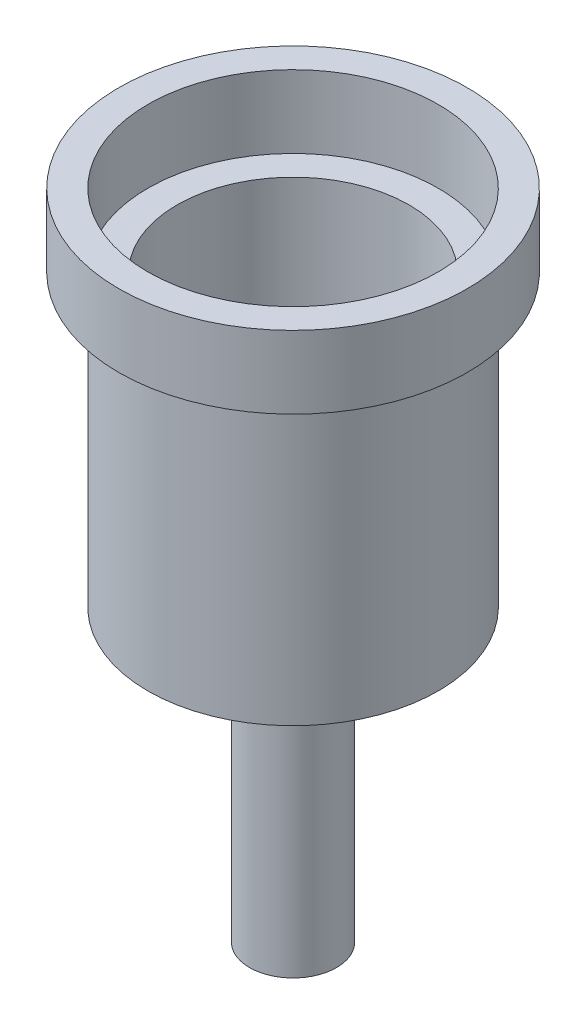
ISO-10303-21;
HEADER;
FILE_DESCRIPTION(('STEP AP214'),'2;1');
FILE_NAME('part.step','',(''),(''),'','','');
FILE_SCHEMA(('AUTOMOTIVE_DESIGN { 1 0 10303 214 1 1 1 1 }'));
ENDSEC;
DATA;
#1=APPLICATION_CONTEXT('core data for automotive mechanical design processes');
#2=APPLICATION_PROTOCOL_DEFINITION('international standard','automotive_design',2000,#1);
#3=PRODUCT_CONTEXT('',#1,'mechanical');
#4=PRODUCT('Part','Part','',(#3));
#5=PRODUCT_RELATED_PRODUCT_CATEGORY('part','',(#4));
#6=PRODUCT_DEFINITION_FORMATION('','',#4);
#7=PRODUCT_DEFINITION_CONTEXT('part definition',#1,'design');
#8=PRODUCT_DEFINITION('design','',#6,#7);
#9=PRODUCT_DEFINITION_SHAPE('','',#8);
#10=(LENGTH_UNIT() NAMED_UNIT(*) SI_UNIT(.MILLI.,.METRE.));
#11=(NAMED_UNIT(*) PLANE_ANGLE_UNIT() SI_UNIT($,.RADIAN.));
#12=(NAMED_UNIT(*) SI_UNIT($,.STERADIAN.) SOLID_ANGLE_UNIT());
#13=UNCERTAINTY_MEASURE_WITH_UNIT(LENGTH_MEASURE(1.E-05),#10,'distance_accuracy_value','');
#14=(GEOMETRIC_REPRESENTATION_CONTEXT(3) GLOBAL_UNCERTAINTY_ASSIGNED_CONTEXT((#13)) GLOBAL_UNIT_ASSIGNED_CONTEXT((#10,
#11,#12)) REPRESENTATION_CONTEXT('',''));
#15=CARTESIAN_POINT('',(0.,0.,0.));
#16=DIRECTION('',(0.,0.,1.));
#17=DIRECTION('',(1.,0.,0.));
#18=AXIS2_PLACEMENT_3D('',#15,#16,#17);
#19=CARTESIAN_POINT('',(0.,28.575,0.));
#20=DIRECTION('',(0.,1.,0.));
#21=DIRECTION('',(0.,0.,1.));
#22=AXIS2_PLACEMENT_3D('',#19,#20,#21);
#23=PLANE('',#22);
#24=CARTESIAN_POINT('',(0.,28.575,0.));
#25=DIRECTION('',(0.,1.,0.));
#26=DIRECTION('',(0.,0.,1.));
#27=AXIS2_PLACEMENT_3D('',#24,#25,#26);
#28=CIRCLE('',#27,7.62);
#29=CARTESIAN_POINT('',(0.,28.575,7.62));
#30=VERTEX_POINT('',#29);
#31=EDGE_CURVE('E11',#30,#30,#28,.T.);
#32=ORIENTED_EDGE('',*,*,#31,.T.);
#33=EDGE_LOOP('',(#32));
#34=FACE_BOUND('',#33,.T.);
#35=CARTESIAN_POINT('',(0.,28.575,0.));
#36=DIRECTION('',(0.,1.,0.));
#37=DIRECTION('',(0.,0.,1.));
#38=AXIS2_PLACEMENT_3D('',#35,#36,#37);
#39=CIRCLE('',#38,6.35);
#40=CARTESIAN_POINT('',(0.,28.575,6.35));
#41=VERTEX_POINT('',#40);
#42=EDGE_CURVE('E58',#41,#41,#39,.T.);
#43=ORIENTED_EDGE('',*,*,#42,.F.);
#44=EDGE_LOOP('',(#43));
#45=FACE_BOUND('',#44,.T.);
#46=ADVANCED_FACE('F47',(#34,#45),#23,.T.);
#47=CARTESIAN_POINT('',(0.,25.4,0.));
#48=DIRECTION('',(0.,1.,0.));
#49=DIRECTION('',(0.,0.,1.));
#50=AXIS2_PLACEMENT_3D('',#47,#48,#49);
#51=PLANE('',#50);
#52=CARTESIAN_POINT('',(0.,25.4,0.));
#53=DIRECTION('',(0.,1.,0.));
#54=DIRECTION('',(0.,0.,1.));
#55=AXIS2_PLACEMENT_3D('',#52,#53,#54);
#56=CIRCLE('',#55,7.62);
#57=CARTESIAN_POINT('',(0.,25.4,7.62));
#58=VERTEX_POINT('',#57);
#59=EDGE_CURVE('E51',#58,#58,#56,.T.);
#60=ORIENTED_EDGE('',*,*,#59,.F.);
#61=EDGE_LOOP('',(#60));
#62=FACE_BOUND('',#61,.T.);
#63=CARTESIAN_POINT('',(0.,25.4,0.));
#64=DIRECTION('',(0.,1.,0.));
#65=DIRECTION('',(0.,0.,1.));
#66=AXIS2_PLACEMENT_3D('',#63,#64,#65);
#67=CIRCLE('',#66,6.35);
#68=CARTESIAN_POINT('',(0.,25.4,6.35));
#69=VERTEX_POINT('',#68);
#70=EDGE_CURVE('E60',#69,#69,#67,.T.);
#71=ORIENTED_EDGE('',*,*,#70,.T.);
#72=EDGE_LOOP('',(#71));
#73=FACE_BOUND('',#72,.T.);
#74=ADVANCED_FACE('F70',(#62,#73),#51,.F.);
#75=CARTESIAN_POINT('',(0.,28.575,0.));
#76=DIRECTION('',(0.,-1.,0.));
#77=DIRECTION('',(0.,0.,-1.));
#78=AXIS2_PLACEMENT_3D('',#75,#76,#77);
#79=CYLINDRICAL_SURFACE('',#78,7.62);
#80=ORIENTED_EDGE('',*,*,#31,.F.);
#81=EDGE_LOOP('',(#80));
#82=FACE_BOUND('',#81,.T.);
#83=ORIENTED_EDGE('',*,*,#59,.T.);
#84=EDGE_LOOP('',(#83));
#85=FACE_BOUND('',#84,.T.);
#86=ADVANCED_FACE('F49',(#82,#85),#79,.T.);
#87=CARTESIAN_POINT('',(0.,28.575,0.));
#88=DIRECTION('',(0.,-1.,0.));
#89=DIRECTION('',(0.,0.,-1.));
#90=AXIS2_PLACEMENT_3D('',#87,#88,#89);
#91=CYLINDRICAL_SURFACE('',#90,6.35);
#92=ORIENTED_EDGE('',*,*,#42,.T.);
#93=EDGE_LOOP('',(#92));
#94=FACE_BOUND('',#93,.T.);
#95=ORIENTED_EDGE('',*,*,#70,.F.);
#96=EDGE_LOOP('',(#95));
#97=FACE_BOUND('',#96,.T.);
#98=ADVANCED_FACE('F66',(#94,#97),#91,.F.);
#99=CLOSED_SHELL('',(#46,#74,#86,#98));
#100=MANIFOLD_SOLID_BREP('B2',#99);
#101=CARTESIAN_POINT('',(0.,12.7,0.));
#102=DIRECTION('',(0.,-1.,0.));
#103=DIRECTION('',(0.,0.,-1.));
#104=AXIS2_PLACEMENT_3D('',#101,#102,#103);
#105=CYLINDRICAL_SURFACE('',#104,1.905);
#106=CARTESIAN_POINT('',(0.,6.35,0.));
#107=DIRECTION('',(0.,1.,0.));
#108=DIRECTION('',(0.,0.,1.));
#109=AXIS2_PLACEMENT_3D('',#106,#107,#108);
#110=CIRCLE('',#109,1.905);
#111=CARTESIAN_POINT('',(-1.41990316571237,6.35,-1.27));
#112=VERTEX_POINT('',#111);
#113=CARTESIAN_POINT('',(-1.41990316571237,6.35,1.27));
#114=VERTEX_POINT('',#113);
#115=EDGE_CURVE('E189',#112,#114,#110,.T.);
#116=ORIENTED_EDGE('',*,*,#115,.T.);
#117=DIRECTION('',(0.,-1.,0.));
#118=VECTOR('',#117,1.);
#119=CARTESIAN_POINT('',(-1.41990316571237,12.7,1.27));
#120=LINE('',#119,#118);
#121=CARTESIAN_POINT('',(-1.41990316571237,2.54,1.27));
#122=VERTEX_POINT('',#121);
#123=EDGE_CURVE('E261',#114,#122,#120,.T.);
#124=ORIENTED_EDGE('',*,*,#123,.T.);
#125=CARTESIAN_POINT('',(0.,2.54,0.));
#126=DIRECTION('',(0.,-1.,0.));
#127=DIRECTION('',(0.,0.,-1.));
#128=AXIS2_PLACEMENT_3D('',#125,#126,#127);
#129=CIRCLE('',#128,1.905);
#130=CARTESIAN_POINT('',(-1.41990316571237,2.54,-1.27));
#131=VERTEX_POINT('',#130);
#132=EDGE_CURVE('E169',#122,#131,#129,.T.);
#133=ORIENTED_EDGE('',*,*,#132,.T.);
#134=DIRECTION('',(0.,-1.,0.));
#135=VECTOR('',#134,1.);
#136=CARTESIAN_POINT('',(-1.41990316571237,12.7,-1.27));
#137=LINE('',#136,#135);
#138=EDGE_CURVE('E257',#131,#112,#137,.F.);
#139=ORIENTED_EDGE('',*,*,#138,.T.);
#140=EDGE_LOOP('',(#116,#124,#133,#139));
#141=FACE_BOUND('',#140,.T.);
#142=CARTESIAN_POINT('',(0.,12.7,0.));
#143=DIRECTION('',(0.,1.,0.));
#144=DIRECTION('',(0.,0.,1.));
#145=AXIS2_PLACEMENT_3D('',#142,#143,#144);
#146=CIRCLE('',#145,1.905);
#147=CARTESIAN_POINT('',(0.,12.7,1.905));
#148=VERTEX_POINT('',#147);
#149=EDGE_CURVE('E132',#148,#148,#146,.T.);
#150=ORIENTED_EDGE('',*,*,#149,.F.);
#151=EDGE_LOOP('',(#150));
#152=FACE_BOUND('',#151,.T.);
#153=CARTESIAN_POINT('',(0.,0.,0.));
#154=DIRECTION('',(0.,1.,0.));
#155=DIRECTION('',(0.,0.,1.));
#156=AXIS2_PLACEMENT_3D('',#153,#154,#155);
#157=CIRCLE('',#156,1.905);
#158=CARTESIAN_POINT('',(0.,0.,1.905));
#159=VERTEX_POINT('',#158);
#160=EDGE_CURVE('E200',#159,#159,#157,.T.);
#161=ORIENTED_EDGE('',*,*,#160,.T.);
#162=EDGE_LOOP('',(#161));
#163=FACE_BOUND('',#162,.T.);
#164=ADVANCED_FACE('F125',(#141,#152,#163),#105,.T.);
#165=CARTESIAN_POINT('',(0.,0.,0.));
#166=DIRECTION('',(0.,1.,0.));
#167=DIRECTION('',(0.,0.,1.));
#168=AXIS2_PLACEMENT_3D('',#165,#166,#167);
#169=PLANE('',#168);
#170=ORIENTED_EDGE('',*,*,#160,.F.);
#171=EDGE_LOOP('',(#170));
#172=FACE_BOUND('',#171,.T.);
#173=ADVANCED_FACE('F208',(#172),#169,.F.);
#174=CARTESIAN_POINT('',(0.,25.4,0.));
#175=DIRECTION('',(0.,-1.,0.));
#176=DIRECTION('',(0.,0.,-1.));
#177=AXIS2_PLACEMENT_3D('',#174,#175,#176);
#178=CYLINDRICAL_SURFACE('',#177,6.35);
#179=CARTESIAN_POINT('',(0.,25.4,0.));
#180=DIRECTION('',(0.,1.,0.));
#181=DIRECTION('',(0.,0.,1.));
#182=AXIS2_PLACEMENT_3D('',#179,#180,#181);
#183=CIRCLE('',#182,6.35);
#184=CARTESIAN_POINT('',(0.,25.4,6.35));
#185=VERTEX_POINT('',#184);
#186=EDGE_CURVE('E197',#185,#185,#183,.T.);
#187=ORIENTED_EDGE('',*,*,#186,.F.);
#188=EDGE_LOOP('',(#187));
#189=FACE_BOUND('',#188,.T.);
#190=CARTESIAN_POINT('',(0.,12.7,0.));
#191=DIRECTION('',(0.,1.,0.));
#192=DIRECTION('',(0.,0.,1.));
#193=AXIS2_PLACEMENT_3D('',#190,#191,#192);
#194=CIRCLE('',#193,6.35);
#195=CARTESIAN_POINT('',(0.,12.7,6.35));
#196=VERTEX_POINT('',#195);
#197=EDGE_CURVE('E195',#196,#196,#194,.T.);
#198=ORIENTED_EDGE('',*,*,#197,.T.);
#199=EDGE_LOOP('',(#198));
#200=FACE_BOUND('',#199,.T.);
#201=ADVANCED_FACE('F210',(#189,#200),#178,.T.);
#202=CARTESIAN_POINT('',(0.,25.4,0.));
#203=DIRECTION('',(0.,1.,0.));
#204=DIRECTION('',(0.,0.,1.));
#205=AXIS2_PLACEMENT_3D('',#202,#203,#204);
#206=PLANE('',#205);
#207=CARTESIAN_POINT('',(0.,25.4,0.));
#208=DIRECTION('',(0.,1.,0.));
#209=DIRECTION('',(0.,0.,1.));
#210=AXIS2_PLACEMENT_3D('',#207,#208,#209);
#211=CIRCLE('',#210,5.08);
#212=CARTESIAN_POINT('',(0.,25.4,5.08));
#213=VERTEX_POINT('',#212);
#214=EDGE_CURVE('E182',#213,#213,#211,.T.);
#215=ORIENTED_EDGE('',*,*,#214,.F.);
#216=EDGE_LOOP('',(#215));
#217=FACE_BOUND('',#216,.T.);
#218=ORIENTED_EDGE('',*,*,#186,.T.);
#219=EDGE_LOOP('',(#218));
#220=FACE_BOUND('',#219,.T.);
#221=ADVANCED_FACE('F215',(#217,#220),#206,.T.);
#222=CARTESIAN_POINT('',(0.,12.7,0.));
#223=DIRECTION('',(0.,1.,0.));
#224=DIRECTION('',(0.,0.,1.));
#225=AXIS2_PLACEMENT_3D('',#222,#223,#224);
#226=PLANE('',#225);
#227=ORIENTED_EDGE('',*,*,#149,.T.);
#228=EDGE_LOOP('',(#227));
#229=FACE_BOUND('',#228,.T.);
#230=ORIENTED_EDGE('',*,*,#197,.F.);
#231=EDGE_LOOP('',(#230));
#232=FACE_BOUND('',#231,.T.);
#233=ADVANCED_FACE('F220',(#229,#232),#226,.F.);
#234=CARTESIAN_POINT('',(0.,15.24,0.));
#235=DIRECTION('',(0.,1.,0.));
#236=DIRECTION('',(0.,0.,1.));
#237=AXIS2_PLACEMENT_3D('',#234,#235,#236);
#238=CYLINDRICAL_SURFACE('',#237,5.08);
#239=CARTESIAN_POINT('',(0.,15.24,0.));
#240=DIRECTION('',(0.,1.,0.));
#241=DIRECTION('',(0.,0.,1.));
#242=AXIS2_PLACEMENT_3D('',#239,#240,#241);
#243=CIRCLE('',#242,5.08);
#244=CARTESIAN_POINT('',(0.,15.24,5.08));
#245=VERTEX_POINT('',#244);
#246=EDGE_CURVE('E186',#245,#245,#243,.T.);
#247=ORIENTED_EDGE('',*,*,#246,.F.);
#248=EDGE_LOOP('',(#247));
#249=FACE_BOUND('',#248,.T.);
#250=ORIENTED_EDGE('',*,*,#214,.T.);
#251=EDGE_LOOP('',(#250));
#252=FACE_BOUND('',#251,.T.);
#253=ADVANCED_FACE('F223',(#249,#252),#238,.F.);
#254=CARTESIAN_POINT('',(0.,15.24,0.));
#255=DIRECTION('',(0.,1.,0.));
#256=DIRECTION('',(0.,0.,1.));
#257=AXIS2_PLACEMENT_3D('',#254,#255,#256);
#258=PLANE('',#257);
#259=CARTESIAN_POINT('',(0.,15.24,0.));
#260=DIRECTION('',(0.,1.,0.));
#261=DIRECTION('',(0.,0.,1.));
#262=AXIS2_PLACEMENT_3D('',#259,#260,#261);
#263=CIRCLE('',#262,1.27);
#264=CARTESIAN_POINT('',(0.,15.24,1.27));
#265=VERTEX_POINT('',#264);
#266=EDGE_CURVE('E183',#265,#265,#263,.T.);
#267=ORIENTED_EDGE('',*,*,#266,.F.);
#268=EDGE_LOOP('',(#267));
#269=FACE_BOUND('',#268,.T.);
#270=ORIENTED_EDGE('',*,*,#246,.T.);
#271=EDGE_LOOP('',(#270));
#272=FACE_BOUND('',#271,.T.);
#273=ADVANCED_FACE('F230',(#269,#272),#258,.T.);
#274=CARTESIAN_POINT('',(0.,2.54,0.));
#275=DIRECTION('',(0.,1.,0.));
#276=DIRECTION('',(0.,0.,1.));
#277=AXIS2_PLACEMENT_3D('',#274,#275,#276);
#278=CYLINDRICAL_SURFACE('',#277,1.27);
#279=CARTESIAN_POINT('',(0.,6.35,0.));
#280=DIRECTION('',(0.,1.,0.));
#281=DIRECTION('',(0.,0.,1.));
#282=AXIS2_PLACEMENT_3D('',#279,#280,#281);
#283=CIRCLE('',#282,1.27);
#284=CARTESIAN_POINT('',(0.,6.35,1.27));
#285=VERTEX_POINT('',#284);
#286=CARTESIAN_POINT('',(0.,6.35,-1.27));
#287=VERTEX_POINT('',#286);
#288=EDGE_CURVE('E45',#285,#287,#283,.F.);
#289=ORIENTED_EDGE('',*,*,#288,.T.);
#290=DIRECTION('',(0.,1.,0.));
#291=VECTOR('',#290,1.);
#292=CARTESIAN_POINT('',(0.,6.35,-1.27));
#293=LINE('',#292,#291);
#294=CARTESIAN_POINT('',(0.,2.54,-1.27));
#295=VERTEX_POINT('',#294);
#296=EDGE_CURVE('E171',#295,#287,#293,.T.);
#297=ORIENTED_EDGE('',*,*,#296,.F.);
#298=CARTESIAN_POINT('',(0.,2.54,0.));
#299=DIRECTION('',(0.,1.,0.));
#300=DIRECTION('',(0.,0.,1.));
#301=AXIS2_PLACEMENT_3D('',#298,#299,#300);
#302=CIRCLE('',#301,1.27);
#303=CARTESIAN_POINT('',(0.,2.54,1.27));
#304=VERTEX_POINT('',#303);
#305=EDGE_CURVE('E167',#304,#295,#302,.T.);
#306=ORIENTED_EDGE('',*,*,#305,.F.);
#307=DIRECTION('',(0.,-1.,0.));
#308=VECTOR('',#307,1.);
#309=CARTESIAN_POINT('',(0.,6.35,1.27));
#310=LINE('',#309,#308);
#311=EDGE_CURVE('E174',#285,#304,#310,.T.);
#312=ORIENTED_EDGE('',*,*,#311,.F.);
#313=EDGE_LOOP('',(#289,#297,#306,#312));
#314=FACE_BOUND('',#313,.T.);
#315=ORIENTED_EDGE('',*,*,#266,.T.);
#316=EDGE_LOOP('',(#315));
#317=FACE_BOUND('',#316,.T.);
#318=ADVANCED_FACE('F179',(#314,#317),#278,.F.);
#319=CARTESIAN_POINT('',(0.,2.54,0.));
#320=DIRECTION('',(0.,1.,0.));
#321=DIRECTION('',(0.,0.,1.));
#322=AXIS2_PLACEMENT_3D('',#319,#320,#321);
#323=PLANE('',#322);
#324=ORIENTED_EDGE('',*,*,#305,.T.);
#325=DIRECTION('',(1.,0.,0.));
#326=VECTOR('',#325,1.);
#327=CARTESIAN_POINT('',(-5.08,2.54,-1.27));
#328=LINE('',#327,#326);
#329=EDGE_CURVE('E139',#131,#295,#328,.T.);
#330=ORIENTED_EDGE('',*,*,#329,.F.);
#331=ORIENTED_EDGE('',*,*,#132,.F.);
#332=DIRECTION('',(1.,0.,0.));
#333=VECTOR('',#332,1.);
#334=CARTESIAN_POINT('',(-5.08,2.54,1.27));
#335=LINE('',#334,#333);
#336=EDGE_CURVE('E164',#122,#304,#335,.T.);
#337=ORIENTED_EDGE('',*,*,#336,.T.);
#338=EDGE_LOOP('',(#324,#330,#331,#337));
#339=FACE_BOUND('',#338,.T.);
#340=ADVANCED_FACE('F165',(#339),#323,.T.);
#341=CARTESIAN_POINT('',(-5.08,6.35,1.27));
#342=DIRECTION('',(0.,1.,0.));
#343=DIRECTION('',(0.,0.,1.));
#344=AXIS2_PLACEMENT_3D('',#341,#342,#343);
#345=PLANE('',#344);
#346=DIRECTION('',(1.,0.,0.));
#347=VECTOR('',#346,1.);
#348=CARTESIAN_POINT('',(-5.08,6.35,-1.27));
#349=LINE('',#348,#347);
#350=EDGE_CURVE('E251',#112,#287,#349,.T.);
#351=ORIENTED_EDGE('',*,*,#350,.T.);
#352=ORIENTED_EDGE('',*,*,#288,.F.);
#353=DIRECTION('',(1.,0.,0.));
#354=VECTOR('',#353,1.);
#355=CARTESIAN_POINT('',(-5.08,6.35,1.27));
#356=LINE('',#355,#354);
#357=EDGE_CURVE('E147',#114,#285,#356,.T.);
#358=ORIENTED_EDGE('',*,*,#357,.F.);
#359=ORIENTED_EDGE('',*,*,#115,.F.);
#360=EDGE_LOOP('',(#351,#352,#358,#359));
#361=FACE_BOUND('',#360,.T.);
#362=ADVANCED_FACE('F239',(#361),#345,.F.);
#363=CARTESIAN_POINT('',(-5.08,6.35,1.27));
#364=DIRECTION('',(0.,0.,1.));
#365=DIRECTION('',(0.,-1.,0.));
#366=AXIS2_PLACEMENT_3D('',#363,#364,#365);
#367=PLANE('',#366);
#368=ORIENTED_EDGE('',*,*,#357,.T.);
#369=ORIENTED_EDGE('',*,*,#311,.T.);
#370=ORIENTED_EDGE('',*,*,#336,.F.);
#371=ORIENTED_EDGE('',*,*,#123,.F.);
#372=EDGE_LOOP('',(#368,#369,#370,#371));
#373=FACE_BOUND('',#372,.T.);
#374=ADVANCED_FACE('F175',(#373),#367,.F.);
#375=CARTESIAN_POINT('',(-5.08,6.35,-1.27));
#376=DIRECTION('',(0.,0.,-1.));
#377=DIRECTION('',(0.,1.,0.));
#378=AXIS2_PLACEMENT_3D('',#375,#376,#377);
#379=PLANE('',#378);
#380=ORIENTED_EDGE('',*,*,#329,.T.);
#381=ORIENTED_EDGE('',*,*,#296,.T.);
#382=ORIENTED_EDGE('',*,*,#350,.F.);
#383=ORIENTED_EDGE('',*,*,#138,.F.);
#384=EDGE_LOOP('',(#380,#381,#382,#383));
#385=FACE_BOUND('',#384,.T.);
#386=ADVANCED_FACE('F242',(#385),#379,.F.);
#387=CLOSED_SHELL('',(#164,#173,#201,#221,#233,#253,#273,#318,#340,#362,#374,#386));
#388=MANIFOLD_SOLID_BREP('B6',#387);
#389=ADVANCED_BREP_SHAPE_REPRESENTATION('',(#18,#100,#388),#14);
#390=SHAPE_DEFINITION_REPRESENTATION(#9,#389);
ENDSEC;
END-ISO-10303-21;
